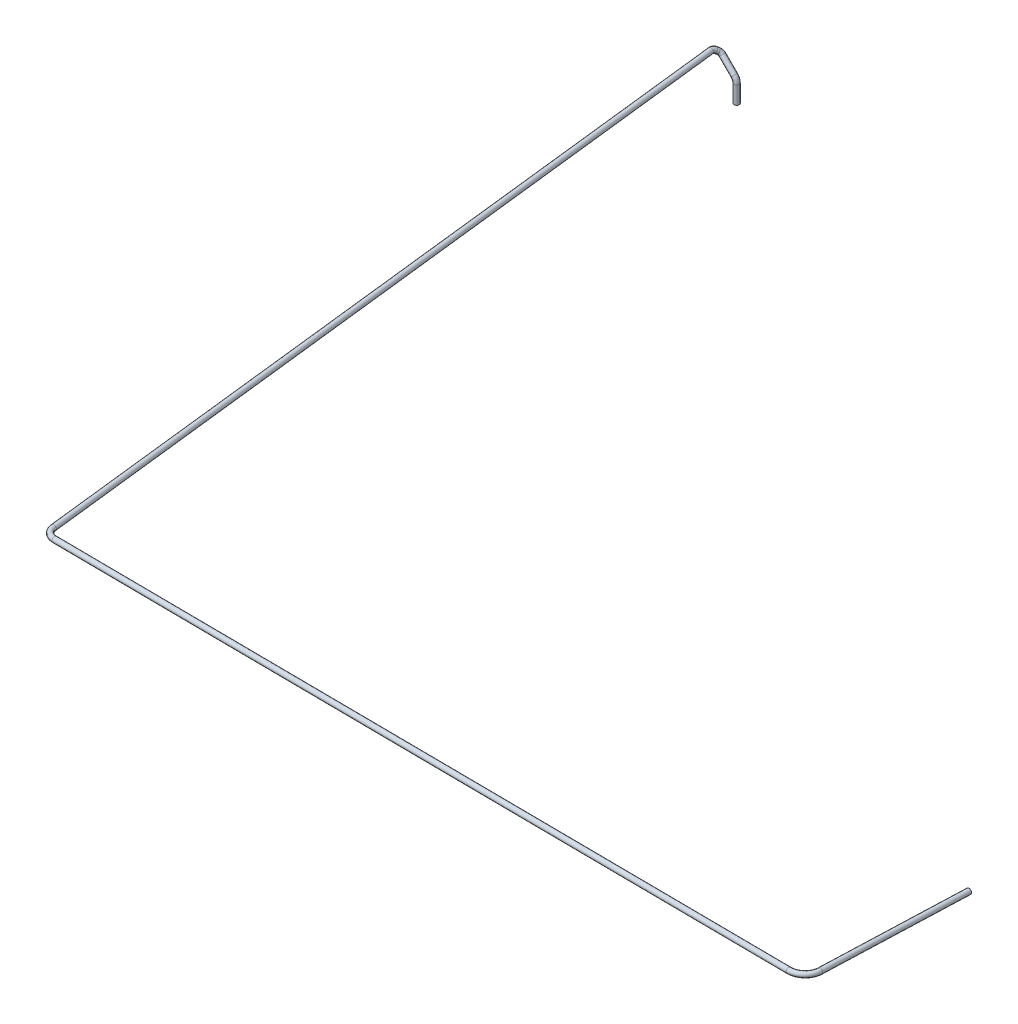
ISO-10303-21;
HEADER;
FILE_DESCRIPTION(('STEP AP214'),'2;1');
FILE_NAME('part.step','',(''),(''),'','','');
FILE_SCHEMA(('AUTOMOTIVE_DESIGN { 1 0 10303 214 1 1 1 1 }'));
ENDSEC;
DATA;
#1=APPLICATION_CONTEXT('core data for automotive mechanical design processes');
#2=APPLICATION_PROTOCOL_DEFINITION('international standard','automotive_design',2000,#1);
#3=PRODUCT_CONTEXT('',#1,'mechanical');
#4=PRODUCT('Part','Part','',(#3));
#5=PRODUCT_RELATED_PRODUCT_CATEGORY('part','',(#4));
#6=PRODUCT_DEFINITION_FORMATION('','',#4);
#7=PRODUCT_DEFINITION_CONTEXT('part definition',#1,'design');
#8=PRODUCT_DEFINITION('design','',#6,#7);
#9=PRODUCT_DEFINITION_SHAPE('','',#8);
#10=(LENGTH_UNIT() NAMED_UNIT(*) SI_UNIT(.MILLI.,.METRE.));
#11=(NAMED_UNIT(*) PLANE_ANGLE_UNIT() SI_UNIT($,.RADIAN.));
#12=(NAMED_UNIT(*) SI_UNIT($,.STERADIAN.) SOLID_ANGLE_UNIT());
#13=UNCERTAINTY_MEASURE_WITH_UNIT(LENGTH_MEASURE(1.E-05),#10,'distance_accuracy_value','');
#14=(GEOMETRIC_REPRESENTATION_CONTEXT(3) GLOBAL_UNCERTAINTY_ASSIGNED_CONTEXT((#13)) GLOBAL_UNIT_ASSIGNED_CONTEXT((#10,
#11,#12)) REPRESENTATION_CONTEXT('',''));
#15=CARTESIAN_POINT('',(0.,0.,0.));
#16=DIRECTION('',(0.,0.,1.));
#17=DIRECTION('',(1.,0.,0.));
#18=AXIS2_PLACEMENT_3D('',#15,#16,#17);
#19=CARTESIAN_POINT('',(0.,0.,0.));
#20=DIRECTION('',(0.,1.,0.));
#21=DIRECTION('',(0.,0.,1.));
#22=AXIS2_PLACEMENT_3D('',#19,#20,#21);
#23=PLANE('',#22);
#24=CARTESIAN_POINT('',(0.,0.,0.));
#25=DIRECTION('',(0.,1.,0.));
#26=DIRECTION('',(0.,0.,1.));
#27=AXIS2_PLACEMENT_3D('',#24,#25,#26);
#28=CIRCLE('',#27,0.25);
#29=CARTESIAN_POINT('',(0.,0.,0.25));
#30=VERTEX_POINT('',#29);
#31=EDGE_CURVE('E18',#30,#30,#28,.T.);
#32=ORIENTED_EDGE('',*,*,#31,.F.);
#33=EDGE_LOOP('',(#32));
#34=FACE_BOUND('',#33,.T.);
#35=ADVANCED_FACE('F15',(#34),#23,.F.);
#36=CARTESIAN_POINT('',(0.,1.54406466651835,0.));
#37=DIRECTION('',(0.,1.,0.));
#38=DIRECTION('',(0.,0.,1.));
#39=AXIS2_PLACEMENT_3D('',#36,#37,#38);
#40=CYLINDRICAL_SURFACE('',#39,0.25);
#41=CARTESIAN_POINT('',(0.,1.68933982822018,0.));
#42=DIRECTION('',(0.,1.,0.));
#43=DIRECTION('',(1.,0.,0.));
#44=AXIS2_PLACEMENT_3D('',#41,#42,#43);
#45=CIRCLE('',#44,0.25);
#46=CARTESIAN_POINT('',(0.25,1.68933982822018,0.));
#47=VERTEX_POINT('',#46);
#48=EDGE_CURVE('E95',#47,#47,#45,.T.);
#49=ORIENTED_EDGE('',*,*,#48,.F.);
#50=EDGE_LOOP('',(#49));
#51=FACE_BOUND('',#50,.T.);
#52=ORIENTED_EDGE('',*,*,#31,.T.);
#53=EDGE_LOOP('',(#52));
#54=FACE_BOUND('',#53,.T.);
#55=ADVANCED_FACE('F90',(#51,#54),#40,.T.);
#56=CARTESIAN_POINT('',(-0.75,1.68933982822018,0.));
#57=DIRECTION('',(0.,0.,1.));
#58=DIRECTION('',(1.,0.,0.));
#59=AXIS2_PLACEMENT_3D('',#56,#57,#58);
#60=TOROIDAL_SURFACE('',#59,0.75,0.25);
#61=ORIENTED_EDGE('',*,*,#48,.T.);
#62=EDGE_LOOP('',(#61));
#63=FACE_BOUND('',#62,.T.);
#64=CARTESIAN_POINT('',(-0.219669914110089,2.21966991411009,0.));
#65=DIRECTION('',(-0.707106781186549,0.707106781186546,0.));
#66=DIRECTION('',(-0.707106781186546,-0.707106781186549,0.));
#67=AXIS2_PLACEMENT_3D('',#64,#65,#66);
#68=CIRCLE('',#67,0.25);
#69=CARTESIAN_POINT('',(-0.396446609406725,2.04289321881345,0.));
#70=VERTEX_POINT('',#69);
#71=EDGE_CURVE('E94',#70,#70,#68,.T.);
#72=ORIENTED_EDGE('',*,*,#71,.F.);
#73=EDGE_LOOP('',(#72));
#74=FACE_BOUND('',#73,.T.);
#75=ADVANCED_FACE('F86',(#63,#74),#60,.T.);
#76=CARTESIAN_POINT('',(-0.21966991411009,2.21966991411009,0.));
#77=DIRECTION('',(-0.707106781186549,0.707106781186546,0.));
#78=DIRECTION('',(-0.707106781186546,-0.707106781186549,0.));
#79=AXIS2_PLACEMENT_3D('',#76,#77,#78);
#80=CYLINDRICAL_SURFACE('',#79,0.25);
#81=ORIENTED_EDGE('',*,*,#71,.T.);
#82=EDGE_LOOP('',(#81));
#83=FACE_BOUND('',#82,.T.);
#84=CARTESIAN_POINT('',(-1.35662096167545,3.35662096167544,0.));
#85=DIRECTION('',(-0.70710678118655,0.707106781186546,0.));
#86=DIRECTION('',(0.,0.,-1.));
#87=AXIS2_PLACEMENT_3D('',#84,#85,#86);
#88=CIRCLE('',#87,0.25);
#89=CARTESIAN_POINT('',(-1.35662096167546,3.35662096167544,-0.25));
#90=VERTEX_POINT('',#89);
#91=EDGE_CURVE('E75',#90,#90,#88,.T.);
#92=ORIENTED_EDGE('',*,*,#91,.F.);
#93=EDGE_LOOP('',(#92));
#94=FACE_BOUND('',#93,.T.);
#95=ADVANCED_FACE('F82',(#83,#94),#80,.T.);
#96=CARTESIAN_POINT('',(-1.35662096167544,3.35662096167545,0.5));
#97=DIRECTION('',(0.707106781186546,0.70710678118655,0.));
#98=DIRECTION('',(-0.70710678118655,0.707106781186545,0.));
#99=AXIS2_PLACEMENT_3D('',#96,#97,#98);
#100=TOROIDAL_SURFACE('',#99,0.5,0.25);
#101=CARTESIAN_POINT('',(-1.61110092442085,3.61110092442085,0.152897857796598));
#102=DIRECTION('',(-0.490876557032797,0.490876557032826,0.719778029333507));
#103=DIRECTION('',(0.,-0.82616386479575,0.563429914457646));
#104=AXIS2_PLACEMENT_3D('',#101,#102,#103);
#105=CIRCLE('',#104,0.25);
#106=CARTESIAN_POINT('',(-1.61110092442085,3.40455995822191,0.293755336411009));
#107=VERTEX_POINT('',#106);
#108=EDGE_CURVE('E72',#107,#107,#105,.T.);
#109=ORIENTED_EDGE('',*,*,#108,.F.);
#110=EDGE_LOOP('',(#109));
#111=FACE_BOUND('',#110,.T.);
#112=ORIENTED_EDGE('',*,*,#91,.T.);
#113=EDGE_LOOP('',(#112));
#114=FACE_BOUND('',#113,.T.);
#115=ADVANCED_FACE('F79',(#111,#114),#100,.T.);
#116=CARTESIAN_POINT('',(-1.61110092442085,3.61110092442085,0.152897857796596));
#117=DIRECTION('',(-0.490876557032797,0.490876557032826,0.719778029333507));
#118=DIRECTION('',(0.,-0.82616386479575,0.563429914457646));
#119=AXIS2_PLACEMENT_3D('',#116,#117,#118);
#120=CYLINDRICAL_SURFACE('',#119,0.25);
#121=CARTESIAN_POINT('',(-1.70355864945063,3.70355864945063,0.288469699973904));
#122=DIRECTION('',(-0.490876557032798,0.490876557032824,0.719778029333507));
#123=DIRECTION('',(-0.560418468760761,0.45465056091138,-0.692260072035655));
#124=AXIS2_PLACEMENT_3D('',#121,#122,#123);
#125=CIRCLE('',#124,0.25);
#126=CARTESIAN_POINT('',(-1.84366326664082,3.81722128967847,0.11540468196499));
#127=VERTEX_POINT('',#126);
#128=EDGE_CURVE('E68',#127,#127,#125,.T.);
#129=ORIENTED_EDGE('',*,*,#128,.F.);
#130=EDGE_LOOP('',(#129));
#131=FACE_BOUND('',#130,.T.);
#132=ORIENTED_EDGE('',*,*,#108,.T.);
#133=EDGE_LOOP('',(#132));
#134=FACE_BOUND('',#133,.T.);
#135=ADVANCED_FACE('F61',(#131,#134),#120,.T.);
#136=CARTESIAN_POINT('',(-1.42334941507025,3.47623336899494,0.634599735991732));
#137=DIRECTION('',(0.667061725500324,0.743191141778862,-0.0519189864496811));
#138=DIRECTION('',(-0.744194837410347,0.667962606716714,0.));
#139=AXIS2_PLACEMENT_3D('',#136,#137,#138);
#140=TOROIDAL_SURFACE('',#139,0.5,0.25);
#141=ORIENTED_EDGE('',*,*,#128,.T.);
#142=EDGE_LOOP('',(#141));
#143=FACE_BOUND('',#142,.T.);
#144=CARTESIAN_POINT('',(-1.79265337637931,3.81065310560931,0.676766356963937));
#145=DIRECTION('',(0.0974011859181513,-0.0179077031624398,0.995084078432161));
#146=DIRECTION('',(0.995243671500691,0.,-0.0974168072656093));
#147=AXIS2_PLACEMENT_3D('',#144,#145,#146);
#148=CIRCLE('',#147,0.25);
#149=CARTESIAN_POINT('',(-1.54384245850414,3.81065310560931,0.652412155147535));
#150=VERTEX_POINT('',#149);
#151=EDGE_CURVE('E71',#150,#150,#148,.T.);
#152=ORIENTED_EDGE('',*,*,#151,.F.);
#153=EDGE_LOOP('',(#152));
#154=FACE_BOUND('',#153,.T.);
#155=ADVANCED_FACE('F56',(#143,#154),#140,.T.);
#156=CARTESIAN_POINT('',(78.0486372325958,1.56066017177983,55.7934255526867));
#157=DIRECTION('',(0.00454389115415025,-0.0313134335197787,-0.999499285609741));
#158=DIRECTION('',(0.,0.999509604073823,-0.0313137567881829));
#159=AXIS2_PLACEMENT_3D('',#156,#157,#158);
#160=PLANE('',#159);
#161=CARTESIAN_POINT('',(78.0486372325957,1.56066017177983,55.7934255526867));
#162=DIRECTION('',(0.00454389115413945,-0.0313134335197666,-0.999499285609741));
#163=DIRECTION('',(0.,0.999509604073823,-0.0313137567881708));
#164=AXIS2_PLACEMENT_3D('',#161,#162,#163);
#165=CIRCLE('',#164,0.25);
#166=CARTESIAN_POINT('',(78.0486372325957,1.81053757279828,55.7855971134897));
#167=VERTEX_POINT('',#166);
#168=EDGE_CURVE('E97',#167,#167,#165,.F.);
#169=ORIENTED_EDGE('',*,*,#168,.F.);
#170=EDGE_LOOP('',(#169));
#171=FACE_BOUND('',#170,.T.);
#172=ADVANCED_FACE('F52',(#171),#160,.T.);
#173=CARTESIAN_POINT('',(-1.79265337637931,3.81065310560931,0.676766356963939));
#174=DIRECTION('',(0.0974011859181513,-0.0179077031624398,0.995084078432161));
#175=DIRECTION('',(0.995243671500691,0.,-0.0974168072656093));
#176=AXIS2_PLACEMENT_3D('',#173,#174,#175);
#177=CYLINDRICAL_SURFACE('',#176,0.25);
#178=ORIENTED_EDGE('',*,*,#151,.T.);
#179=EDGE_LOOP('',(#178));
#180=FACE_BOUND('',#179,.T.);
#181=CARTESIAN_POINT('',(5.03833211763405,2.55474169774906,70.464468026282));
#182=DIRECTION('',(0.0974011859181862,-0.0179077031624288,0.995084078432158));
#183=DIRECTION('',(-0.995223017974727,0.00492294736356812,0.0975033798518369));
#184=AXIS2_PLACEMENT_3D('',#181,#182,#183);
#185=CIRCLE('',#184,0.25);
#186=CARTESIAN_POINT('',(4.78952636314037,2.55597243458995,70.488843871245));
#187=VERTEX_POINT('',#186);
#188=EDGE_CURVE('E99',#187,#187,#185,.T.);
#189=ORIENTED_EDGE('',*,*,#188,.F.);
#190=EDGE_LOOP('',(#189));
#191=FACE_BOUND('',#190,.T.);
#192=ADVANCED_FACE('F48',(#180,#191),#177,.T.);
#193=CARTESIAN_POINT('',(77.9840928608775,2.00545645415392,69.9909604922563));
#194=DIRECTION('',(0.00454389115413945,-0.0313134335197666,-0.999499285609741));
#195=DIRECTION('',(0.,0.999509604073823,-0.0313137567881708));
#196=AXIS2_PLACEMENT_3D('',#193,#194,#195);
#197=CYLINDRICAL_SURFACE('',#196,0.25);
#198=ORIENTED_EDGE('',*,*,#168,.T.);
#199=EDGE_LOOP('',(#198));
#200=FACE_BOUND('',#199,.T.);
#201=CARTESIAN_POINT('',(77.9840928608775,2.00545645415392,69.9909604922563));
#202=DIRECTION('',(0.00454389115410182,-0.0313134335197708,-0.999499285609741));
#203=DIRECTION('',(0.999967077956353,-0.0065772906958307,0.00475207854897613));
#204=AXIS2_PLACEMENT_3D('',#201,#202,#203);
#205=CIRCLE('',#204,0.25);
#206=CARTESIAN_POINT('',(78.2340846303666,2.00381213147996,69.9921485118935));
#207=VERTEX_POINT('',#206);
#208=EDGE_CURVE('E27',#207,#207,#205,.F.);
#209=ORIENTED_EDGE('',*,*,#208,.F.);
#210=EDGE_LOOP('',(#209));
#211=FACE_BOUND('',#210,.T.);
#212=ADVANCED_FACE('F44',(#200,#211),#197,.T.);
#213=CARTESIAN_POINT('',(76.484142243943,2.01532239019766,69.9838323744328));
#214=DIRECTION('',(0.00672280124745335,0.999487972978317,-0.031282516124535));
#215=DIRECTION('',(0.,0.0312832230716834,0.999510560201465));
#216=AXIS2_PLACEMENT_3D('',#213,#214,#215);
#217=TOROIDAL_SURFACE('',#216,1.49999999999999,0.25);
#218=CARTESIAN_POINT('',(76.4819808971659,2.06226169961191,71.4830962037209));
#219=DIRECTION('',(0.999976363599045,-0.00667442691758972,0.00165053583804398));
#220=DIRECTION('',(0.00667443600907397,0.999977725703908,0.));
#221=AXIS2_PLACEMENT_3D('',#218,#219,#220);
#222=CIRCLE('',#221,0.25);
#223=CARTESIAN_POINT('',(76.4836495061681,2.31225613103789,71.4830962037209));
#224=VERTEX_POINT('',#223);
#225=EDGE_CURVE('E22',#224,#224,#222,.F.);
#226=ORIENTED_EDGE('',*,*,#225,.F.);
#227=EDGE_LOOP('',(#226));
#228=FACE_BOUND('',#227,.T.);
#229=ORIENTED_EDGE('',*,*,#208,.T.);
#230=EDGE_LOOP('',(#229));
#231=FACE_BOUND('',#230,.T.);
#232=ADVANCED_FACE('F40',(#228,#231),#217,.T.);
#233=CARTESIAN_POINT('',(6.03355513560876,2.54981875038549,70.3669646464302));
#234=DIRECTION('',(0.00664480812416663,0.999827524504453,0.0173426574748836));
#235=DIRECTION('',(0.,-0.0173430403568595,0.999849598165234));
#236=AXIS2_PLACEMENT_3D('',#233,#234,#235);
#237=TOROIDAL_SURFACE('',#236,0.999999999999989,0.25);
#238=CARTESIAN_POINT('',(6.03178913214784,2.53248747032256,71.3668128888966));
#239=DIRECTION('',(0.999976363599045,-0.00667442691758972,0.00165053583804398));
#240=DIRECTION('',(0.00667443600907397,0.999977725703908,0.));
#241=AXIS2_PLACEMENT_3D('',#238,#239,#240);
#242=CIRCLE('',#241,0.25);
#243=CARTESIAN_POINT('',(6.03345774115011,2.78248190174854,71.3668128888966));
#244=VERTEX_POINT('',#243);
#245=EDGE_CURVE('E10',#244,#244,#242,.T.);
#246=ORIENTED_EDGE('',*,*,#245,.F.);
#247=EDGE_LOOP('',(#246));
#248=FACE_BOUND('',#247,.T.);
#249=ORIENTED_EDGE('',*,*,#188,.T.);
#250=EDGE_LOOP('',(#249));
#251=FACE_BOUND('',#250,.T.);
#252=ADVANCED_FACE('F35',(#248,#251),#237,.T.);
#253=CARTESIAN_POINT('',(6.03178913214784,2.53248747032256,71.3668128888966));
#254=DIRECTION('',(0.999976363599045,-0.00667442691758972,0.00165053583804398));
#255=DIRECTION('',(0.00667443600907397,0.999977725703908,0.));
#256=AXIS2_PLACEMENT_3D('',#253,#254,#255);
#257=CYLINDRICAL_SURFACE('',#256,0.25);
#258=ORIENTED_EDGE('',*,*,#225,.T.);
#259=EDGE_LOOP('',(#258));
#260=FACE_BOUND('',#259,.T.);
#261=ORIENTED_EDGE('',*,*,#245,.T.);
#262=EDGE_LOOP('',(#261));
#263=FACE_BOUND('',#262,.T.);
#264=ADVANCED_FACE('F39',(#260,#263),#257,.T.);
#265=CLOSED_SHELL('',(#35,#55,#75,#95,#115,#135,#155,#172,#192,#212,#232,#252,#264));
#266=MANIFOLD_SOLID_BREP('B1',#265);
#267=ADVANCED_BREP_SHAPE_REPRESENTATION('',(#18,#266),#14);
#268=SHAPE_DEFINITION_REPRESENTATION(#9,#267);
ENDSEC;
END-ISO-10303-21;
